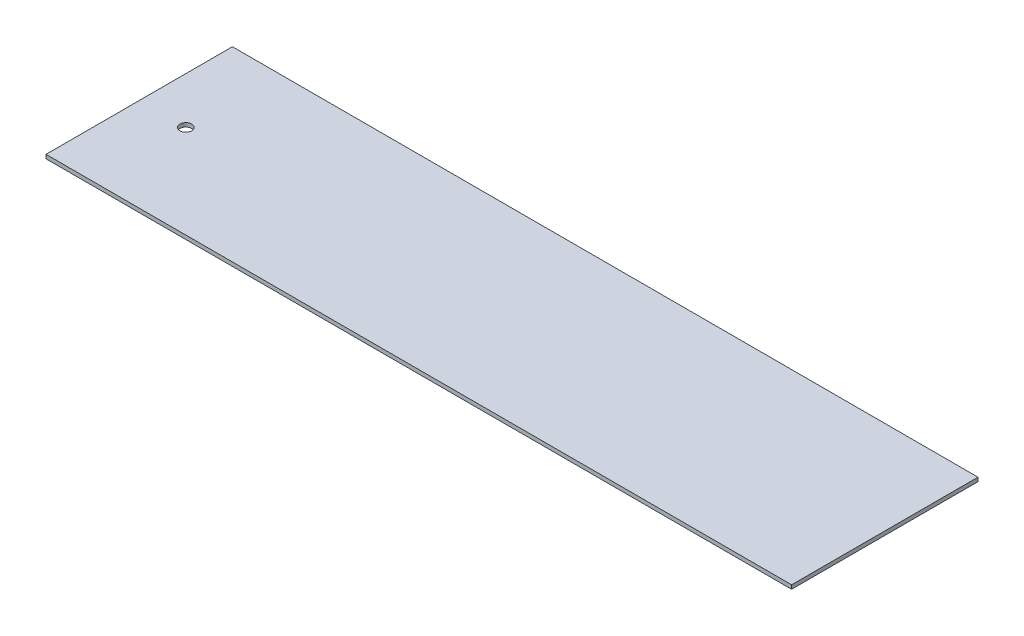
ISO-10303-21;
HEADER;
FILE_DESCRIPTION(('STEP AP214'),'2;1');
FILE_NAME('part.step','',(''),(''),'','','');
FILE_SCHEMA(('AUTOMOTIVE_DESIGN { 1 0 10303 214 1 1 1 1 }'));
ENDSEC;
DATA;
#1=APPLICATION_CONTEXT('core data for automotive mechanical design processes');
#2=APPLICATION_PROTOCOL_DEFINITION('international standard','automotive_design',2000,#1);
#3=PRODUCT_CONTEXT('',#1,'mechanical');
#4=PRODUCT('Part','Part','',(#3));
#5=PRODUCT_RELATED_PRODUCT_CATEGORY('part','',(#4));
#6=PRODUCT_DEFINITION_FORMATION('','',#4);
#7=PRODUCT_DEFINITION_CONTEXT('part definition',#1,'design');
#8=PRODUCT_DEFINITION('design','',#6,#7);
#9=PRODUCT_DEFINITION_SHAPE('','',#8);
#10=(LENGTH_UNIT() NAMED_UNIT(*) SI_UNIT(.MILLI.,.METRE.));
#11=(NAMED_UNIT(*) PLANE_ANGLE_UNIT() SI_UNIT($,.RADIAN.));
#12=(NAMED_UNIT(*) SI_UNIT($,.STERADIAN.) SOLID_ANGLE_UNIT());
#13=UNCERTAINTY_MEASURE_WITH_UNIT(LENGTH_MEASURE(1.E-05),#10,'distance_accuracy_value','');
#14=(GEOMETRIC_REPRESENTATION_CONTEXT(3) GLOBAL_UNCERTAINTY_ASSIGNED_CONTEXT((#13)) GLOBAL_UNIT_ASSIGNED_CONTEXT((#10,
#11,#12)) REPRESENTATION_CONTEXT('',''));
#15=CARTESIAN_POINT('',(0.,0.,0.));
#16=DIRECTION('',(0.,0.,1.));
#17=DIRECTION('',(1.,0.,0.));
#18=AXIS2_PLACEMENT_3D('',#15,#16,#17);
#19=CARTESIAN_POINT('',(0.,1.5875,0.));
#20=DIRECTION('',(1.,0.,0.));
#21=DIRECTION('',(0.,0.,-1.));
#22=AXIS2_PLACEMENT_3D('',#19,#20,#21);
#23=PLANE('',#22);
#24=DIRECTION('',(0.,0.,1.));
#25=VECTOR('',#24,1.);
#26=CARTESIAN_POINT('',(0.,0.,0.));
#27=LINE('',#26,#25);
#28=CARTESIAN_POINT('',(0.,0.,-76.2));
#29=VERTEX_POINT('',#28);
#30=CARTESIAN_POINT('',(0.,0.,0.));
#31=VERTEX_POINT('',#30);
#32=EDGE_CURVE('E107',#29,#31,#27,.T.);
#33=ORIENTED_EDGE('',*,*,#32,.T.);
#34=DIRECTION('',(0.,-1.,0.));
#35=VECTOR('',#34,1.);
#36=CARTESIAN_POINT('',(0.,1.5875,0.));
#37=LINE('',#36,#35);
#38=CARTESIAN_POINT('',(0.,1.5875,0.));
#39=VERTEX_POINT('',#38);
#40=EDGE_CURVE('E11',#39,#31,#37,.T.);
#41=ORIENTED_EDGE('',*,*,#40,.F.);
#42=DIRECTION('',(0.,0.,1.));
#43=VECTOR('',#42,1.);
#44=CARTESIAN_POINT('',(0.,1.5875,0.));
#45=LINE('',#44,#43);
#46=CARTESIAN_POINT('',(0.,1.5875,-76.2));
#47=VERTEX_POINT('',#46);
#48=EDGE_CURVE('E91',#47,#39,#45,.T.);
#49=ORIENTED_EDGE('',*,*,#48,.F.);
#50=DIRECTION('',(0.,-1.,0.));
#51=VECTOR('',#50,1.);
#52=CARTESIAN_POINT('',(0.,1.5875,-76.2));
#53=LINE('',#52,#51);
#54=EDGE_CURVE('E103',#47,#29,#53,.T.);
#55=ORIENTED_EDGE('',*,*,#54,.T.);
#56=EDGE_LOOP('',(#33,#41,#49,#55));
#57=FACE_BOUND('',#56,.T.);
#58=ADVANCED_FACE('F39',(#57),#23,.F.);
#59=CARTESIAN_POINT('',(0.,1.5875,0.));
#60=DIRECTION('',(0.,0.,-1.));
#61=DIRECTION('',(-1.,0.,0.));
#62=AXIS2_PLACEMENT_3D('',#59,#60,#61);
#63=PLANE('',#62);
#64=DIRECTION('',(1.,0.,0.));
#65=VECTOR('',#64,1.);
#66=CARTESIAN_POINT('',(0.,0.,0.));
#67=LINE('',#66,#65);
#68=CARTESIAN_POINT('',(304.8,0.,0.));
#69=VERTEX_POINT('',#68);
#70=EDGE_CURVE('E96',#31,#69,#67,.T.);
#71=ORIENTED_EDGE('',*,*,#70,.T.);
#72=DIRECTION('',(0.,-1.,0.));
#73=VECTOR('',#72,1.);
#74=CARTESIAN_POINT('',(304.8,1.5875,0.));
#75=LINE('',#74,#73);
#76=CARTESIAN_POINT('',(304.8,1.5875,0.));
#77=VERTEX_POINT('',#76);
#78=EDGE_CURVE('E48',#77,#69,#75,.T.);
#79=ORIENTED_EDGE('',*,*,#78,.F.);
#80=DIRECTION('',(1.,0.,0.));
#81=VECTOR('',#80,1.);
#82=CARTESIAN_POINT('',(0.,1.5875,0.));
#83=LINE('',#82,#81);
#84=EDGE_CURVE('E86',#39,#77,#83,.T.);
#85=ORIENTED_EDGE('',*,*,#84,.F.);
#86=ORIENTED_EDGE('',*,*,#40,.T.);
#87=EDGE_LOOP('',(#71,#79,#85,#86));
#88=FACE_BOUND('',#87,.T.);
#89=ADVANCED_FACE('F95',(#88),#63,.F.);
#90=CARTESIAN_POINT('',(304.8,1.5875,0.));
#91=DIRECTION('',(-1.,0.,0.));
#92=DIRECTION('',(0.,0.,1.));
#93=AXIS2_PLACEMENT_3D('',#90,#91,#92);
#94=PLANE('',#93);
#95=DIRECTION('',(0.,0.,-1.));
#96=VECTOR('',#95,1.);
#97=CARTESIAN_POINT('',(304.8,0.,0.));
#98=LINE('',#97,#96);
#99=CARTESIAN_POINT('',(304.8,0.,-76.2));
#100=VERTEX_POINT('',#99);
#101=EDGE_CURVE('E73',#69,#100,#98,.T.);
#102=ORIENTED_EDGE('',*,*,#101,.T.);
#103=DIRECTION('',(0.,-1.,0.));
#104=VECTOR('',#103,1.);
#105=CARTESIAN_POINT('',(304.8,1.5875,-76.2));
#106=LINE('',#105,#104);
#107=CARTESIAN_POINT('',(304.8,1.5875,-76.2));
#108=VERTEX_POINT('',#107);
#109=EDGE_CURVE('E98',#108,#100,#106,.T.);
#110=ORIENTED_EDGE('',*,*,#109,.F.);
#111=DIRECTION('',(0.,0.,-1.));
#112=VECTOR('',#111,1.);
#113=CARTESIAN_POINT('',(304.8,1.5875,0.));
#114=LINE('',#113,#112);
#115=EDGE_CURVE('E89',#77,#108,#114,.T.);
#116=ORIENTED_EDGE('',*,*,#115,.F.);
#117=ORIENTED_EDGE('',*,*,#78,.T.);
#118=EDGE_LOOP('',(#102,#110,#116,#117));
#119=FACE_BOUND('',#118,.T.);
#120=ADVANCED_FACE('F99',(#119),#94,.F.);
#121=CARTESIAN_POINT('',(0.,1.5875,-76.2));
#122=DIRECTION('',(0.,0.,1.));
#123=DIRECTION('',(1.,0.,0.));
#124=AXIS2_PLACEMENT_3D('',#121,#122,#123);
#125=PLANE('',#124);
#126=DIRECTION('',(-1.,0.,0.));
#127=VECTOR('',#126,1.);
#128=CARTESIAN_POINT('',(0.,0.,-76.2));
#129=LINE('',#128,#127);
#130=EDGE_CURVE('E79',#100,#29,#129,.T.);
#131=ORIENTED_EDGE('',*,*,#130,.T.);
#132=ORIENTED_EDGE('',*,*,#54,.F.);
#133=DIRECTION('',(-1.,0.,0.));
#134=VECTOR('',#133,1.);
#135=CARTESIAN_POINT('',(0.,1.5875,-76.2));
#136=LINE('',#135,#134);
#137=EDGE_CURVE('E56',#108,#47,#136,.T.);
#138=ORIENTED_EDGE('',*,*,#137,.F.);
#139=ORIENTED_EDGE('',*,*,#109,.T.);
#140=EDGE_LOOP('',(#131,#132,#138,#139));
#141=FACE_BOUND('',#140,.T.);
#142=ADVANCED_FACE('F121',(#141),#125,.F.);
#143=CARTESIAN_POINT('',(0.,1.5875,0.));
#144=DIRECTION('',(0.,-1.,0.));
#145=DIRECTION('',(0.,0.,-1.));
#146=AXIS2_PLACEMENT_3D('',#143,#144,#145);
#147=PLANE('',#146);
#148=CARTESIAN_POINT('',(19.05,1.5875,-38.1));
#149=DIRECTION('',(0.,1.,0.));
#150=DIRECTION('',(0.,0.,1.));
#151=AXIS2_PLACEMENT_3D('',#148,#149,#150);
#152=CIRCLE('',#151,2.41299999999999);
#153=CARTESIAN_POINT('',(19.05,1.5875,-35.687));
#154=VERTEX_POINT('',#153);
#155=EDGE_CURVE('E128',#154,#154,#152,.T.);
#156=ORIENTED_EDGE('',*,*,#155,.F.);
#157=EDGE_LOOP('',(#156));
#158=FACE_BOUND('',#157,.T.);
#159=ORIENTED_EDGE('',*,*,#48,.T.);
#160=ORIENTED_EDGE('',*,*,#84,.T.);
#161=ORIENTED_EDGE('',*,*,#115,.T.);
#162=ORIENTED_EDGE('',*,*,#137,.T.);
#163=EDGE_LOOP('',(#159,#160,#161,#162));
#164=FACE_BOUND('',#163,.T.);
#165=ADVANCED_FACE('F87',(#158,#164),#147,.F.);
#166=CARTESIAN_POINT('',(0.,0.,0.));
#167=DIRECTION('',(0.,-1.,0.));
#168=DIRECTION('',(0.,0.,-1.));
#169=AXIS2_PLACEMENT_3D('',#166,#167,#168);
#170=PLANE('',#169);
#171=CARTESIAN_POINT('',(19.05,0.,-38.1));
#172=DIRECTION('',(0.,1.,0.));
#173=DIRECTION('',(0.,0.,1.));
#174=AXIS2_PLACEMENT_3D('',#171,#172,#173);
#175=CIRCLE('',#174,2.41299999999999);
#176=CARTESIAN_POINT('',(19.05,0.,-35.687));
#177=VERTEX_POINT('',#176);
#178=EDGE_CURVE('E111',#177,#177,#175,.T.);
#179=ORIENTED_EDGE('',*,*,#178,.T.);
#180=EDGE_LOOP('',(#179));
#181=FACE_BOUND('',#180,.T.);
#182=ORIENTED_EDGE('',*,*,#32,.F.);
#183=ORIENTED_EDGE('',*,*,#130,.F.);
#184=ORIENTED_EDGE('',*,*,#101,.F.);
#185=ORIENTED_EDGE('',*,*,#70,.F.);
#186=EDGE_LOOP('',(#182,#183,#184,#185));
#187=FACE_BOUND('',#186,.T.);
#188=ADVANCED_FACE('F124',(#181,#187),#170,.T.);
#189=CARTESIAN_POINT('',(19.05,0.,-38.1));
#190=DIRECTION('',(0.,1.,0.));
#191=DIRECTION('',(0.,0.,1.));
#192=AXIS2_PLACEMENT_3D('',#189,#190,#191);
#193=CYLINDRICAL_SURFACE('',#192,2.41299999999999);
#194=ORIENTED_EDGE('',*,*,#178,.F.);
#195=EDGE_LOOP('',(#194));
#196=FACE_BOUND('',#195,.T.);
#197=ORIENTED_EDGE('',*,*,#155,.T.);
#198=EDGE_LOOP('',(#197));
#199=FACE_BOUND('',#198,.T.);
#200=ADVANCED_FACE('F137',(#196,#199),#193,.F.);
#201=CLOSED_SHELL('',(#58,#89,#120,#142,#165,#188,#200));
#202=MANIFOLD_SOLID_BREP('B2',#201);
#203=ADVANCED_BREP_SHAPE_REPRESENTATION('',(#18,#202),#14);
#204=SHAPE_DEFINITION_REPRESENTATION(#9,#203);
ENDSEC;
END-ISO-10303-21;
